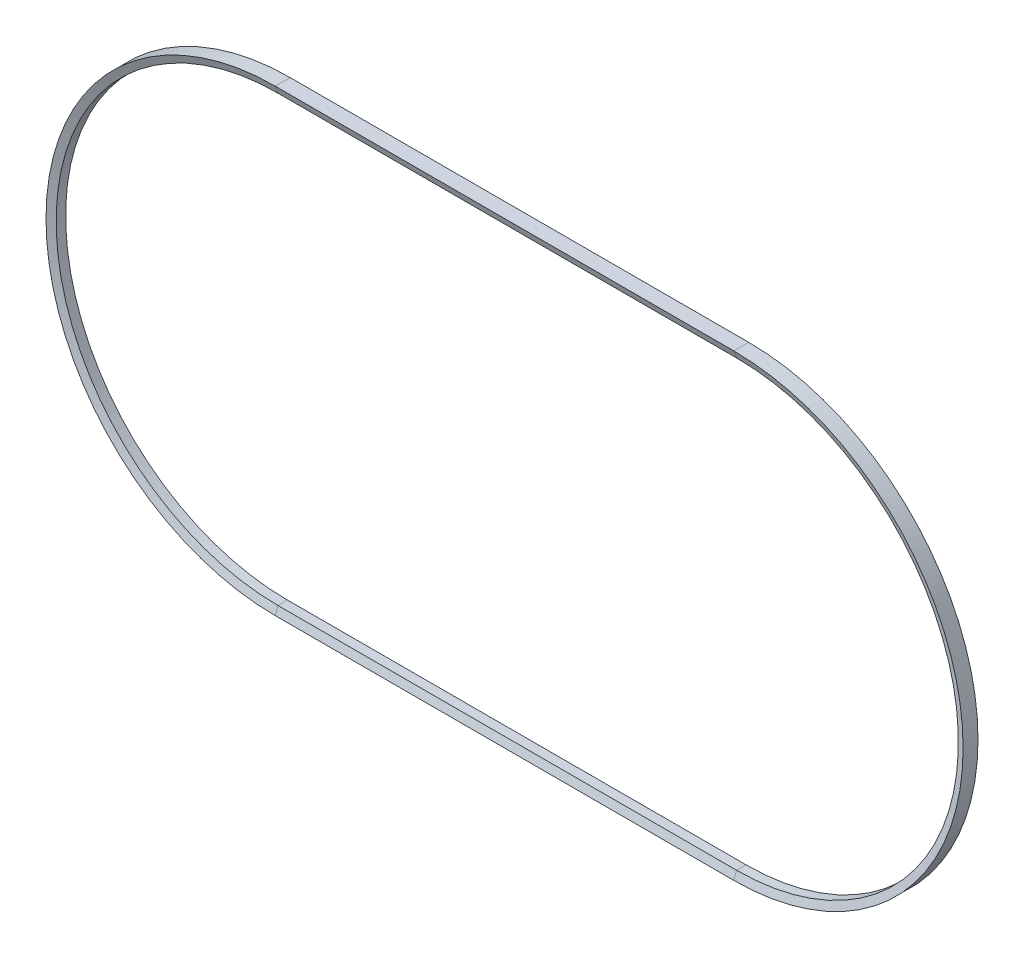
ISO-10303-21;
HEADER;
FILE_DESCRIPTION(('STEP AP214'),'2;1');
FILE_NAME('part.step','',(''),(''),'','','');
FILE_SCHEMA(('AUTOMOTIVE_DESIGN { 1 0 10303 214 1 1 1 1 }'));
ENDSEC;
DATA;
#1=APPLICATION_CONTEXT('core data for automotive mechanical design processes');
#2=APPLICATION_PROTOCOL_DEFINITION('international standard','automotive_design',2000,#1);
#3=PRODUCT_CONTEXT('',#1,'mechanical');
#4=PRODUCT('Part','Part','',(#3));
#5=PRODUCT_RELATED_PRODUCT_CATEGORY('part','',(#4));
#6=PRODUCT_DEFINITION_FORMATION('','',#4);
#7=PRODUCT_DEFINITION_CONTEXT('part definition',#1,'design');
#8=PRODUCT_DEFINITION('design','',#6,#7);
#9=PRODUCT_DEFINITION_SHAPE('','',#8);
#10=(LENGTH_UNIT() NAMED_UNIT(*) SI_UNIT(.MILLI.,.METRE.));
#11=(NAMED_UNIT(*) PLANE_ANGLE_UNIT() SI_UNIT($,.RADIAN.));
#12=(NAMED_UNIT(*) SI_UNIT($,.STERADIAN.) SOLID_ANGLE_UNIT());
#13=UNCERTAINTY_MEASURE_WITH_UNIT(LENGTH_MEASURE(1.E-05),#10,'distance_accuracy_value','');
#14=(GEOMETRIC_REPRESENTATION_CONTEXT(3) GLOBAL_UNCERTAINTY_ASSIGNED_CONTEXT((#13)) GLOBAL_UNIT_ASSIGNED_CONTEXT((#10,
#11,#12)) REPRESENTATION_CONTEXT('',''));
#15=CARTESIAN_POINT('',(0.,0.,0.));
#16=DIRECTION('',(0.,0.,1.));
#17=DIRECTION('',(1.,0.,0.));
#18=AXIS2_PLACEMENT_3D('',#15,#16,#17);
#19=CARTESIAN_POINT('',(0.,93.8619670041451,-3.048));
#20=DIRECTION('',(0.,-1.,0.));
#21=DIRECTION('',(1.,0.,0.));
#22=AXIS2_PLACEMENT_3D('',#19,#20,#21);
#23=PLANE('',#22);
#24=DIRECTION('',(-1.,0.,0.));
#25=VECTOR('',#24,1.);
#26=CARTESIAN_POINT('',(0.,93.8619670041451,3.048));
#27=LINE('',#26,#25);
#28=CARTESIAN_POINT('',(93.8619670041452,93.8619670041449,3.048));
#29=VERTEX_POINT('',#28);
#30=CARTESIAN_POINT('',(-93.8619670041453,93.861967004145,3.048));
#31=VERTEX_POINT('',#30);
#32=EDGE_CURVE('E141',#29,#31,#27,.T.);
#33=ORIENTED_EDGE('',*,*,#32,.F.);
#34=DIRECTION('',(0.,0.,1.));
#35=VECTOR('',#34,1.);
#36=CARTESIAN_POINT('',(93.8619670041452,93.8619670041449,-3.048));
#37=LINE('',#36,#35);
#38=CARTESIAN_POINT('',(93.8619670041452,93.8619670041449,-3.048));
#39=VERTEX_POINT('',#38);
#40=EDGE_CURVE('E130',#39,#29,#37,.T.);
#41=ORIENTED_EDGE('',*,*,#40,.F.);
#42=DIRECTION('',(-1.,0.,0.));
#43=VECTOR('',#42,1.);
#44=CARTESIAN_POINT('',(0.,93.8619670041451,-3.048));
#45=LINE('',#44,#43);
#46=CARTESIAN_POINT('',(-93.8619670041453,93.861967004145,-3.048));
#47=VERTEX_POINT('',#46);
#48=EDGE_CURVE('E126',#39,#47,#45,.T.);
#49=ORIENTED_EDGE('',*,*,#48,.T.);
#50=DIRECTION('',(0.,0.,1.));
#51=VECTOR('',#50,1.);
#52=CARTESIAN_POINT('',(-93.8619670041453,93.861967004145,-3.048));
#53=LINE('',#52,#51);
#54=EDGE_CURVE('E128',#47,#31,#53,.T.);
#55=ORIENTED_EDGE('',*,*,#54,.T.);
#56=EDGE_LOOP('',(#33,#41,#49,#55));
#57=FACE_BOUND('',#56,.T.);
#58=ADVANCED_FACE('F32',(#57),#23,.F.);
#59=CARTESIAN_POINT('',(0.,93.8619670041451,3.048));
#60=DIRECTION('',(0.,0.34202014332567,-0.939692620785908));
#61=DIRECTION('',(0.,0.939692620785908,0.34202014332567));
#62=AXIS2_PLACEMENT_3D('',#59,#60,#61);
#63=PLANE('',#62);
#64=DIRECTION('',(-1.,0.,0.));
#65=VECTOR('',#64,1.);
#66=CARTESIAN_POINT('',(0.,90.8139670041451,1.93861872595661));
#67=LINE('',#66,#65);
#68=CARTESIAN_POINT('',(93.8619670041452,90.8139670041449,1.93861872595661));
#69=VERTEX_POINT('',#68);
#70=CARTESIAN_POINT('',(-93.8619670041453,90.8139670041451,1.93861872595661));
#71=VERTEX_POINT('',#70);
#72=EDGE_CURVE('E56',#69,#71,#67,.T.);
#73=ORIENTED_EDGE('',*,*,#72,.F.);
#74=DIRECTION('',(0.,-0.939692620785908,-0.34202014332567));
#75=VECTOR('',#74,1.);
#76=CARTESIAN_POINT('',(93.8619670041452,93.8619670041449,3.048));
#77=LINE('',#76,#75);
#78=EDGE_CURVE('E168',#29,#69,#77,.T.);
#79=ORIENTED_EDGE('',*,*,#78,.F.);
#80=ORIENTED_EDGE('',*,*,#32,.T.);
#81=DIRECTION('',(0.,-0.939692620785908,-0.34202014332567));
#82=VECTOR('',#81,1.);
#83=CARTESIAN_POINT('',(-93.8619670041453,93.861967004145,3.048));
#84=LINE('',#83,#82);
#85=EDGE_CURVE('E171',#31,#71,#84,.T.);
#86=ORIENTED_EDGE('',*,*,#85,.T.);
#87=EDGE_LOOP('',(#73,#79,#80,#86));
#88=FACE_BOUND('',#87,.T.);
#89=ADVANCED_FACE('F213',(#88),#63,.F.);
#90=CARTESIAN_POINT('',(0.,90.8139670041451,1.93861872595661));
#91=DIRECTION('',(0.,1.,0.));
#92=DIRECTION('',(-1.,0.,0.));
#93=AXIS2_PLACEMENT_3D('',#90,#91,#92);
#94=PLANE('',#93);
#95=DIRECTION('',(-1.,0.,0.));
#96=VECTOR('',#95,1.);
#97=CARTESIAN_POINT('',(0.,90.8139670041451,-1.93861872595661));
#98=LINE('',#97,#96);
#99=CARTESIAN_POINT('',(93.8619670041452,90.8139670041449,-1.93861872595661));
#100=VERTEX_POINT('',#99);
#101=CARTESIAN_POINT('',(-93.8619670041453,90.8139670041451,-1.93861872595661));
#102=VERTEX_POINT('',#101);
#103=EDGE_CURVE('E47',#100,#102,#98,.T.);
#104=ORIENTED_EDGE('',*,*,#103,.F.);
#105=DIRECTION('',(0.,0.,-1.));
#106=VECTOR('',#105,1.);
#107=CARTESIAN_POINT('',(93.8619670041452,90.8139670041449,1.93861872595661));
#108=LINE('',#107,#106);
#109=EDGE_CURVE('E186',#69,#100,#108,.T.);
#110=ORIENTED_EDGE('',*,*,#109,.F.);
#111=ORIENTED_EDGE('',*,*,#72,.T.);
#112=DIRECTION('',(0.,0.,-1.));
#113=VECTOR('',#112,1.);
#114=CARTESIAN_POINT('',(-93.8619670041453,90.8139670041451,1.93861872595661));
#115=LINE('',#114,#113);
#116=EDGE_CURVE('E174',#71,#102,#115,.T.);
#117=ORIENTED_EDGE('',*,*,#116,.T.);
#118=EDGE_LOOP('',(#104,#110,#111,#117));
#119=FACE_BOUND('',#118,.T.);
#120=ADVANCED_FACE('F212',(#119),#94,.F.);
#121=CARTESIAN_POINT('',(0.,93.8619670041451,-3.048));
#122=DIRECTION('',(0.,0.34202014332567,0.939692620785908));
#123=DIRECTION('',(0.,-0.939692620785908,0.34202014332567));
#124=AXIS2_PLACEMENT_3D('',#121,#122,#123);
#125=PLANE('',#124);
#126=DIRECTION('',(0.,0.939692620785908,-0.34202014332567));
#127=VECTOR('',#126,1.);
#128=CARTESIAN_POINT('',(-93.8619670041453,93.861967004145,-3.048));
#129=LINE('',#128,#127);
#130=EDGE_CURVE('E144',#102,#47,#129,.T.);
#131=ORIENTED_EDGE('',*,*,#130,.T.);
#132=ORIENTED_EDGE('',*,*,#48,.F.);
#133=DIRECTION('',(0.,0.939692620785908,-0.34202014332567));
#134=VECTOR('',#133,1.);
#135=CARTESIAN_POINT('',(93.8619670041452,93.8619670041449,-3.048));
#136=LINE('',#135,#134);
#137=EDGE_CURVE('E11',#100,#39,#136,.T.);
#138=ORIENTED_EDGE('',*,*,#137,.F.);
#139=ORIENTED_EDGE('',*,*,#103,.T.);
#140=EDGE_LOOP('',(#131,#132,#138,#139));
#141=FACE_BOUND('',#140,.T.);
#142=ADVANCED_FACE('F145',(#141),#125,.F.);
#143=CARTESIAN_POINT('',(-93.8619670041453,0.,0.));
#144=DIRECTION('',(0.,0.,1.));
#145=DIRECTION('',(1.,0.,0.));
#146=AXIS2_PLACEMENT_3D('',#143,#144,#145);
#147=CYLINDRICAL_SURFACE('',#146,93.8619670041452);
#148=CARTESIAN_POINT('',(-93.8619670041453,0.,3.048));
#149=DIRECTION('',(0.,0.,1.));
#150=DIRECTION('',(0.,1.,0.));
#151=AXIS2_PLACEMENT_3D('',#148,#149,#150);
#152=CIRCLE('',#151,93.8619670041452);
#153=CARTESIAN_POINT('',(-93.8619670041453,-93.8619670041453,3.048));
#154=VERTEX_POINT('',#153);
#155=EDGE_CURVE('E114',#31,#154,#152,.T.);
#156=ORIENTED_EDGE('',*,*,#155,.F.);
#157=ORIENTED_EDGE('',*,*,#54,.F.);
#158=CARTESIAN_POINT('',(-93.8619670041453,0.,-3.048));
#159=DIRECTION('',(0.,0.,1.));
#160=DIRECTION('',(0.,1.,0.));
#161=AXIS2_PLACEMENT_3D('',#158,#159,#160);
#162=CIRCLE('',#161,93.8619670041452);
#163=CARTESIAN_POINT('',(-93.8619670041453,-93.8619670041453,-3.048));
#164=VERTEX_POINT('',#163);
#165=EDGE_CURVE('E139',#47,#164,#162,.T.);
#166=ORIENTED_EDGE('',*,*,#165,.T.);
#167=DIRECTION('',(0.,0.,1.));
#168=VECTOR('',#167,1.);
#169=CARTESIAN_POINT('',(-93.8619670041453,-93.8619670041452,-3.048));
#170=LINE('',#169,#168);
#171=EDGE_CURVE('E152',#164,#154,#170,.T.);
#172=ORIENTED_EDGE('',*,*,#171,.T.);
#173=EDGE_LOOP('',(#156,#157,#166,#172));
#174=FACE_BOUND('',#173,.T.);
#175=ADVANCED_FACE('F137',(#174),#147,.T.);
#176=CARTESIAN_POINT('',(-93.8619670041453,0.,3.048));
#177=DIRECTION('',(0.,0.,1.));
#178=DIRECTION('',(1.,0.,0.));
#179=AXIS2_PLACEMENT_3D('',#176,#177,#178);
#180=CONICAL_SURFACE('',#179,93.8619670041452,1.22173047639603);
#181=CARTESIAN_POINT('',(-93.8619670041453,0.,1.93861872595661));
#182=DIRECTION('',(0.,0.,1.));
#183=DIRECTION('',(0.,1.,0.));
#184=AXIS2_PLACEMENT_3D('',#181,#182,#183);
#185=CIRCLE('',#184,90.8139670041452);
#186=CARTESIAN_POINT('',(-93.8619670041453,-90.8139670041453,1.93861872595661));
#187=VERTEX_POINT('',#186);
#188=EDGE_CURVE('E108',#71,#187,#185,.T.);
#189=ORIENTED_EDGE('',*,*,#188,.F.);
#190=ORIENTED_EDGE('',*,*,#85,.F.);
#191=ORIENTED_EDGE('',*,*,#155,.T.);
#192=DIRECTION('',(0.,0.939692620785908,-0.34202014332567));
#193=VECTOR('',#192,1.);
#194=CARTESIAN_POINT('',(-93.8619670041453,-93.8619670041452,3.048));
#195=LINE('',#194,#193);
#196=EDGE_CURVE('E175',#154,#187,#195,.T.);
#197=ORIENTED_EDGE('',*,*,#196,.T.);
#198=EDGE_LOOP('',(#189,#190,#191,#197));
#199=FACE_BOUND('',#198,.T.);
#200=ADVANCED_FACE('F209',(#199),#180,.F.);
#201=CARTESIAN_POINT('',(-93.8619670041453,0.,0.));
#202=DIRECTION('',(0.,0.,1.));
#203=DIRECTION('',(1.,0.,0.));
#204=AXIS2_PLACEMENT_3D('',#201,#202,#203);
#205=CYLINDRICAL_SURFACE('',#204,90.8139670041452);
#206=CARTESIAN_POINT('',(-93.8619670041453,0.,-1.93861872595661));
#207=DIRECTION('',(0.,0.,1.));
#208=DIRECTION('',(0.,1.,0.));
#209=AXIS2_PLACEMENT_3D('',#206,#207,#208);
#210=CIRCLE('',#209,90.8139670041452);
#211=CARTESIAN_POINT('',(-93.8619670041453,-90.8139670041453,-1.93861872595661));
#212=VERTEX_POINT('',#211);
#213=EDGE_CURVE('E190',#102,#212,#210,.T.);
#214=ORIENTED_EDGE('',*,*,#213,.F.);
#215=ORIENTED_EDGE('',*,*,#116,.F.);
#216=ORIENTED_EDGE('',*,*,#188,.T.);
#217=DIRECTION('',(0.,0.,-1.));
#218=VECTOR('',#217,1.);
#219=CARTESIAN_POINT('',(-93.8619670041453,-90.8139670041453,1.93861872595661));
#220=LINE('',#219,#218);
#221=EDGE_CURVE('E178',#187,#212,#220,.T.);
#222=ORIENTED_EDGE('',*,*,#221,.T.);
#223=EDGE_LOOP('',(#214,#215,#216,#222));
#224=FACE_BOUND('',#223,.T.);
#225=ADVANCED_FACE('F211',(#224),#205,.F.);
#226=CARTESIAN_POINT('',(-93.8619670041453,0.,-1.93861872595661));
#227=DIRECTION('',(0.,0.,-1.));
#228=DIRECTION('',(-1.,0.,0.));
#229=AXIS2_PLACEMENT_3D('',#226,#227,#228);
#230=CONICAL_SURFACE('',#229,90.8139670041452,1.22173047639603);
#231=DIRECTION('',(0.,-0.939692620785908,-0.34202014332567));
#232=VECTOR('',#231,1.);
#233=CARTESIAN_POINT('',(-93.8619670041453,-93.8619670041452,-3.048));
#234=LINE('',#233,#232);
#235=EDGE_CURVE('E150',#212,#164,#234,.T.);
#236=ORIENTED_EDGE('',*,*,#235,.T.);
#237=ORIENTED_EDGE('',*,*,#165,.F.);
#238=ORIENTED_EDGE('',*,*,#130,.F.);
#239=ORIENTED_EDGE('',*,*,#213,.T.);
#240=EDGE_LOOP('',(#236,#237,#238,#239));
#241=FACE_BOUND('',#240,.T.);
#242=ADVANCED_FACE('F149',(#241),#230,.F.);
#243=CARTESIAN_POINT('',(-93.8619670041453,-93.8619670041453,-3.048));
#244=DIRECTION('',(0.,1.,0.));
#245=DIRECTION('',(-1.,0.,0.));
#246=AXIS2_PLACEMENT_3D('',#243,#244,#245);
#247=PLANE('',#246);
#248=DIRECTION('',(1.,0.,0.));
#249=VECTOR('',#248,1.);
#250=CARTESIAN_POINT('',(-93.8619670041453,-93.8619670041453,3.048));
#251=LINE('',#250,#249);
#252=CARTESIAN_POINT('',(93.8619670041452,-93.8619670041452,3.048));
#253=VERTEX_POINT('',#252);
#254=EDGE_CURVE('E95',#154,#253,#251,.T.);
#255=ORIENTED_EDGE('',*,*,#254,.F.);
#256=ORIENTED_EDGE('',*,*,#171,.F.);
#257=DIRECTION('',(1.,0.,0.));
#258=VECTOR('',#257,1.);
#259=CARTESIAN_POINT('',(-93.8619670041453,-93.8619670041453,-3.048));
#260=LINE('',#259,#258);
#261=CARTESIAN_POINT('',(93.8619670041452,-93.8619670041452,-3.048));
#262=VERTEX_POINT('',#261);
#263=EDGE_CURVE('E161',#164,#262,#260,.T.);
#264=ORIENTED_EDGE('',*,*,#263,.T.);
#265=DIRECTION('',(0.,0.,1.));
#266=VECTOR('',#265,1.);
#267=CARTESIAN_POINT('',(93.8619670041453,-93.8619670041452,-3.048));
#268=LINE('',#267,#266);
#269=EDGE_CURVE('E157',#262,#253,#268,.T.);
#270=ORIENTED_EDGE('',*,*,#269,.T.);
#271=EDGE_LOOP('',(#255,#256,#264,#270));
#272=FACE_BOUND('',#271,.T.);
#273=ADVANCED_FACE('F207',(#272),#247,.F.);
#274=CARTESIAN_POINT('',(-93.8619670041453,-93.8619670041453,3.048));
#275=DIRECTION('',(0.,-0.34202014332567,-0.939692620785908));
#276=DIRECTION('',(0.,0.939692620785908,-0.34202014332567));
#277=AXIS2_PLACEMENT_3D('',#274,#275,#276);
#278=PLANE('',#277);
#279=DIRECTION('',(1.,0.,0.));
#280=VECTOR('',#279,1.);
#281=CARTESIAN_POINT('',(-93.8619670041453,-90.8139670041453,1.93861872595661));
#282=LINE('',#281,#280);
#283=CARTESIAN_POINT('',(93.8619670041452,-90.8139670041452,1.93861872595661));
#284=VERTEX_POINT('',#283);
#285=EDGE_CURVE('E88',#187,#284,#282,.T.);
#286=ORIENTED_EDGE('',*,*,#285,.F.);
#287=ORIENTED_EDGE('',*,*,#196,.F.);
#288=ORIENTED_EDGE('',*,*,#254,.T.);
#289=DIRECTION('',(0.,0.939692620785908,-0.34202014332567));
#290=VECTOR('',#289,1.);
#291=CARTESIAN_POINT('',(93.8619670041453,-93.8619670041452,3.048));
#292=LINE('',#291,#290);
#293=EDGE_CURVE('E159',#253,#284,#292,.T.);
#294=ORIENTED_EDGE('',*,*,#293,.T.);
#295=EDGE_LOOP('',(#286,#287,#288,#294));
#296=FACE_BOUND('',#295,.T.);
#297=ADVANCED_FACE('F208',(#296),#278,.F.);
#298=CARTESIAN_POINT('',(-93.8619670041453,-90.8139670041453,1.93861872595661));
#299=DIRECTION('',(0.,-1.,0.));
#300=DIRECTION('',(1.,0.,0.));
#301=AXIS2_PLACEMENT_3D('',#298,#299,#300);
#302=PLANE('',#301);
#303=DIRECTION('',(1.,0.,0.));
#304=VECTOR('',#303,1.);
#305=CARTESIAN_POINT('',(-93.8619670041453,-90.8139670041453,-1.93861872595661));
#306=LINE('',#305,#304);
#307=CARTESIAN_POINT('',(93.8619670041452,-90.8139670041452,-1.93861872595661));
#308=VERTEX_POINT('',#307);
#309=EDGE_CURVE('E79',#212,#308,#306,.T.);
#310=ORIENTED_EDGE('',*,*,#309,.F.);
#311=ORIENTED_EDGE('',*,*,#221,.F.);
#312=ORIENTED_EDGE('',*,*,#285,.T.);
#313=DIRECTION('',(0.,0.,-1.));
#314=VECTOR('',#313,1.);
#315=CARTESIAN_POINT('',(93.8619670041453,-90.8139670041452,1.93861872595661));
#316=LINE('',#315,#314);
#317=EDGE_CURVE('E180',#284,#308,#316,.T.);
#318=ORIENTED_EDGE('',*,*,#317,.T.);
#319=EDGE_LOOP('',(#310,#311,#312,#318));
#320=FACE_BOUND('',#319,.T.);
#321=ADVANCED_FACE('F222',(#320),#302,.F.);
#322=CARTESIAN_POINT('',(-93.8619670041453,-93.8619670041453,-3.048));
#323=DIRECTION('',(0.,-0.34202014332567,0.939692620785908));
#324=DIRECTION('',(0.,-0.939692620785908,-0.34202014332567));
#325=AXIS2_PLACEMENT_3D('',#322,#323,#324);
#326=PLANE('',#325);
#327=DIRECTION('',(0.,-0.939692620785908,-0.34202014332567));
#328=VECTOR('',#327,1.);
#329=CARTESIAN_POINT('',(93.8619670041453,-93.8619670041452,-3.048));
#330=LINE('',#329,#328);
#331=EDGE_CURVE('E170',#308,#262,#330,.T.);
#332=ORIENTED_EDGE('',*,*,#331,.T.);
#333=ORIENTED_EDGE('',*,*,#263,.F.);
#334=ORIENTED_EDGE('',*,*,#235,.F.);
#335=ORIENTED_EDGE('',*,*,#309,.T.);
#336=EDGE_LOOP('',(#332,#333,#334,#335));
#337=FACE_BOUND('',#336,.T.);
#338=ADVANCED_FACE('F199',(#337),#326,.F.);
#339=CARTESIAN_POINT('',(93.8619670041453,-2.84727862634299E-13,0.));
#340=DIRECTION('',(0.,0.,1.));
#341=DIRECTION('',(1.,0.,0.));
#342=AXIS2_PLACEMENT_3D('',#339,#340,#341);
#343=CYLINDRICAL_SURFACE('',#342,93.8619670041452);
#344=CARTESIAN_POINT('',(93.8619670041453,-2.84727862634299E-13,3.048));
#345=DIRECTION('',(0.,0.,1.));
#346=DIRECTION('',(0.,-1.,0.));
#347=AXIS2_PLACEMENT_3D('',#344,#345,#346);
#348=CIRCLE('',#347,93.8619670041452);
#349=EDGE_CURVE('E164',#253,#29,#348,.T.);
#350=ORIENTED_EDGE('',*,*,#349,.F.);
#351=ORIENTED_EDGE('',*,*,#269,.F.);
#352=CARTESIAN_POINT('',(93.8619670041453,-2.84727862634299E-13,-3.048));
#353=DIRECTION('',(0.,0.,1.));
#354=DIRECTION('',(0.,-1.,0.));
#355=AXIS2_PLACEMENT_3D('',#352,#353,#354);
#356=CIRCLE('',#355,93.8619670041452);
#357=EDGE_CURVE('E165',#262,#39,#356,.T.);
#358=ORIENTED_EDGE('',*,*,#357,.T.);
#359=ORIENTED_EDGE('',*,*,#40,.T.);
#360=EDGE_LOOP('',(#350,#351,#358,#359));
#361=FACE_BOUND('',#360,.T.);
#362=ADVANCED_FACE('F204',(#361),#343,.T.);
#363=CARTESIAN_POINT('',(93.8619670041453,-2.84727862634299E-13,3.048));
#364=DIRECTION('',(0.,0.,1.));
#365=DIRECTION('',(1.,0.,0.));
#366=AXIS2_PLACEMENT_3D('',#363,#364,#365);
#367=CONICAL_SURFACE('',#366,93.8619670041452,1.22173047639603);
#368=CARTESIAN_POINT('',(93.8619670041453,-2.84727862634299E-13,1.93861872595661));
#369=DIRECTION('',(0.,0.,1.));
#370=DIRECTION('',(0.,-1.,0.));
#371=AXIS2_PLACEMENT_3D('',#368,#369,#370);
#372=CIRCLE('',#371,90.8139670041452);
#373=EDGE_CURVE('E184',#284,#69,#372,.T.);
#374=ORIENTED_EDGE('',*,*,#373,.F.);
#375=ORIENTED_EDGE('',*,*,#293,.F.);
#376=ORIENTED_EDGE('',*,*,#349,.T.);
#377=ORIENTED_EDGE('',*,*,#78,.T.);
#378=EDGE_LOOP('',(#374,#375,#376,#377));
#379=FACE_BOUND('',#378,.T.);
#380=ADVANCED_FACE('F217',(#379),#367,.F.);
#381=CARTESIAN_POINT('',(93.8619670041453,-2.84727862634299E-13,0.));
#382=DIRECTION('',(0.,0.,1.));
#383=DIRECTION('',(1.,0.,0.));
#384=AXIS2_PLACEMENT_3D('',#381,#382,#383);
#385=CYLINDRICAL_SURFACE('',#384,90.8139670041452);
#386=CARTESIAN_POINT('',(93.8619670041453,-2.84727862634299E-13,-1.93861872595661));
#387=DIRECTION('',(0.,0.,1.));
#388=DIRECTION('',(0.,-1.,0.));
#389=AXIS2_PLACEMENT_3D('',#386,#387,#388);
#390=CIRCLE('',#389,90.8139670041452);
#391=EDGE_CURVE('E40',#308,#100,#390,.T.);
#392=ORIENTED_EDGE('',*,*,#391,.F.);
#393=ORIENTED_EDGE('',*,*,#317,.F.);
#394=ORIENTED_EDGE('',*,*,#373,.T.);
#395=ORIENTED_EDGE('',*,*,#109,.T.);
#396=EDGE_LOOP('',(#392,#393,#394,#395));
#397=FACE_BOUND('',#396,.T.);
#398=ADVANCED_FACE('F221',(#397),#385,.F.);
#399=CARTESIAN_POINT('',(93.8619670041453,-2.84727862634299E-13,-1.93861872595661));
#400=DIRECTION('',(0.,0.,-1.));
#401=DIRECTION('',(-1.,0.,0.));
#402=AXIS2_PLACEMENT_3D('',#399,#400,#401);
#403=CONICAL_SURFACE('',#402,90.8139670041452,1.22173047639603);
#404=ORIENTED_EDGE('',*,*,#137,.T.);
#405=ORIENTED_EDGE('',*,*,#357,.F.);
#406=ORIENTED_EDGE('',*,*,#331,.F.);
#407=ORIENTED_EDGE('',*,*,#391,.T.);
#408=EDGE_LOOP('',(#404,#405,#406,#407));
#409=FACE_BOUND('',#408,.T.);
#410=ADVANCED_FACE('F34',(#409),#403,.F.);
#411=CLOSED_SHELL('',(#58,#89,#120,#142,#175,#200,#225,#242,#273,#297,#321,#338,#362,#380,#398,#410));
#412=MANIFOLD_SOLID_BREP('B2',#411);
#413=ADVANCED_BREP_SHAPE_REPRESENTATION('',(#18,#412),#14);
#414=SHAPE_DEFINITION_REPRESENTATION(#9,#413);
ENDSEC;
END-ISO-10303-21;
